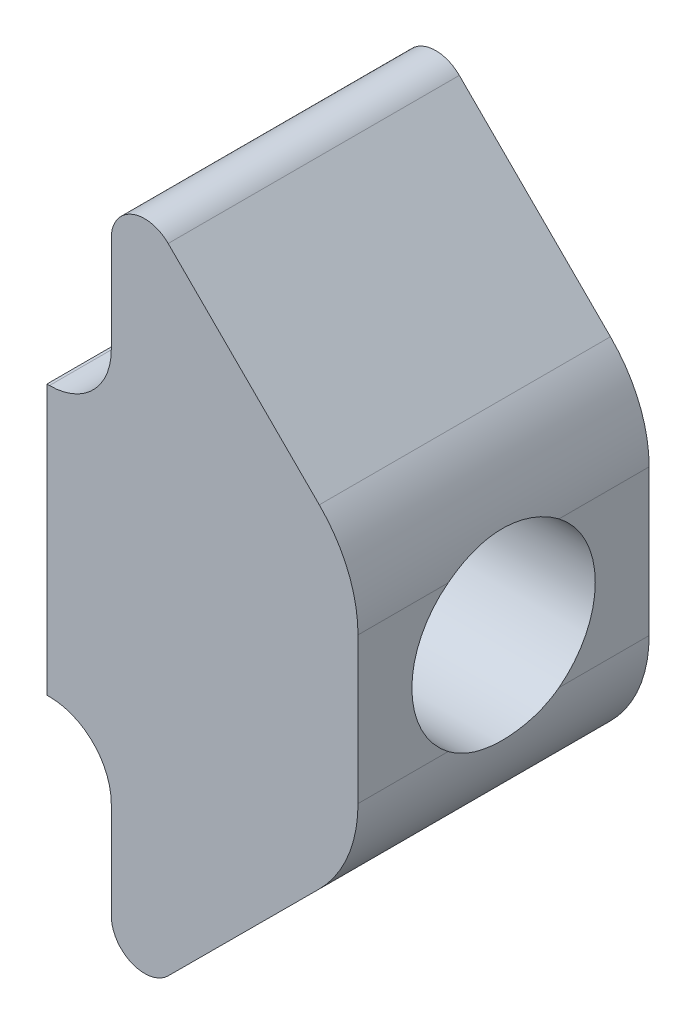
ISO-10303-21;
HEADER;
FILE_DESCRIPTION(('STEP AP214'),'2;1');
FILE_NAME('part.step','',(''),(''),'','','');
FILE_SCHEMA(('AUTOMOTIVE_DESIGN { 1 0 10303 214 1 1 1 1 }'));
ENDSEC;
DATA;
#1=APPLICATION_CONTEXT('core data for automotive mechanical design processes');
#2=APPLICATION_PROTOCOL_DEFINITION('international standard','automotive_design',2000,#1);
#3=PRODUCT_CONTEXT('',#1,'mechanical');
#4=PRODUCT('Part','Part','',(#3));
#5=PRODUCT_RELATED_PRODUCT_CATEGORY('part','',(#4));
#6=PRODUCT_DEFINITION_FORMATION('','',#4);
#7=PRODUCT_DEFINITION_CONTEXT('part definition',#1,'design');
#8=PRODUCT_DEFINITION('design','',#6,#7);
#9=PRODUCT_DEFINITION_SHAPE('','',#8);
#10=(LENGTH_UNIT() NAMED_UNIT(*) SI_UNIT(.MILLI.,.METRE.));
#11=(NAMED_UNIT(*) PLANE_ANGLE_UNIT() SI_UNIT($,.RADIAN.));
#12=(NAMED_UNIT(*) SI_UNIT($,.STERADIAN.) SOLID_ANGLE_UNIT());
#13=UNCERTAINTY_MEASURE_WITH_UNIT(LENGTH_MEASURE(1.E-05),#10,'distance_accuracy_value','');
#14=(GEOMETRIC_REPRESENTATION_CONTEXT(3) GLOBAL_UNCERTAINTY_ASSIGNED_CONTEXT((#13)) GLOBAL_UNIT_ASSIGNED_CONTEXT((#10,
#11,#12)) REPRESENTATION_CONTEXT('',''));
#15=CARTESIAN_POINT('',(0.,0.,0.));
#16=DIRECTION('',(0.,0.,1.));
#17=DIRECTION('',(1.,0.,0.));
#18=AXIS2_PLACEMENT_3D('',#15,#16,#17);
#19=CARTESIAN_POINT('',(-4.80850000000001,1.59318550686057,6.35));
#20=DIRECTION('',(1.,0.,0.));
#21=DIRECTION('',(0.,1.,0.));
#22=AXIS2_PLACEMENT_3D('',#19,#20,#21);
#23=PLANE('',#22);
#24=CARTESIAN_POINT('',(-4.80850000000001,0.,3.175));
#25=DIRECTION('',(1.,0.,0.));
#26=DIRECTION('',(0.,1.,0.));
#27=AXIS2_PLACEMENT_3D('',#24,#25,#26);
#28=CIRCLE('',#27,2.);
#29=CARTESIAN_POINT('',(-4.8085,-1.59318550686057,4.38403264667643));
#30=VERTEX_POINT('',#29);
#31=CARTESIAN_POINT('',(-4.80850000000002,1.59318550686057,4.38403264667644));
#32=VERTEX_POINT('',#31);
#33=EDGE_CURVE('E333',#30,#32,#28,.F.);
#34=ORIENTED_EDGE('',*,*,#33,.T.);
#35=DIRECTION('',(0.,0.,-1.));
#36=VECTOR('',#35,1.);
#37=CARTESIAN_POINT('',(-4.80850000000002,1.59318550686057,6.35));
#38=LINE('',#37,#36);
#39=CARTESIAN_POINT('',(-4.80850000000002,1.59318550686057,6.35));
#40=VERTEX_POINT('',#39);
#41=EDGE_CURVE('E266',#40,#32,#38,.T.);
#42=ORIENTED_EDGE('',*,*,#41,.F.);
#43=DIRECTION('',(0.,-1.,0.));
#44=VECTOR('',#43,1.);
#45=CARTESIAN_POINT('',(-4.80850000000001,1.59318550686057,6.35));
#46=LINE('',#45,#44);
#47=CARTESIAN_POINT('',(-4.8085,-1.59318550686057,6.35));
#48=VERTEX_POINT('',#47);
#49=EDGE_CURVE('E356',#40,#48,#46,.T.);
#50=ORIENTED_EDGE('',*,*,#49,.T.);
#51=DIRECTION('',(0.,0.,-1.));
#52=VECTOR('',#51,1.);
#53=CARTESIAN_POINT('',(-4.8085,-1.59318550686057,6.35));
#54=LINE('',#53,#52);
#55=EDGE_CURVE('E261',#48,#30,#54,.T.);
#56=ORIENTED_EDGE('',*,*,#55,.T.);
#57=EDGE_LOOP('',(#34,#42,#50,#56));
#58=FACE_BOUND('',#57,.T.);
#59=ADVANCED_FACE('F45',(#58),#23,.T.);
#60=CARTESIAN_POINT('',(-11.5392124071298,-2.93845688183043,6.35));
#61=DIRECTION('',(0.,-1.,0.));
#62=DIRECTION('',(1.,0.,0.));
#63=AXIS2_PLACEMENT_3D('',#60,#61,#62);
#64=PLANE('',#63);
#65=DIRECTION('',(-1.,0.,0.));
#66=VECTOR('',#65,1.);
#67=CARTESIAN_POINT('',(-11.5392124071298,-2.93845688183043,0.));
#68=LINE('',#67,#66);
#69=CARTESIAN_POINT('',(-11.5392124071298,-2.93845688183043,0.));
#70=VERTEX_POINT('',#69);
#71=CARTESIAN_POINT('',(-11.5951,-2.93845688183043,0.));
#72=VERTEX_POINT('',#71);
#73=EDGE_CURVE('E197',#70,#72,#68,.T.);
#74=ORIENTED_EDGE('',*,*,#73,.F.);
#75=DIRECTION('',(0.,0.,-1.));
#76=VECTOR('',#75,1.);
#77=CARTESIAN_POINT('',(-11.5392124071298,-2.93845688183043,6.35));
#78=LINE('',#77,#76);
#79=CARTESIAN_POINT('',(-11.5392124071298,-2.93845688183043,6.35));
#80=VERTEX_POINT('',#79);
#81=EDGE_CURVE('E71',#80,#70,#78,.T.);
#82=ORIENTED_EDGE('',*,*,#81,.F.);
#83=DIRECTION('',(-1.,0.,0.));
#84=VECTOR('',#83,1.);
#85=CARTESIAN_POINT('',(-11.5392124071298,-2.93845688183043,6.35));
#86=LINE('',#85,#84);
#87=CARTESIAN_POINT('',(-11.5951,-2.93845688183043,6.35));
#88=VERTEX_POINT('',#87);
#89=EDGE_CURVE('E251',#80,#88,#86,.T.);
#90=ORIENTED_EDGE('',*,*,#89,.T.);
#91=DIRECTION('',(0.,0.,-1.));
#92=VECTOR('',#91,1.);
#93=CARTESIAN_POINT('',(-11.5951,-2.93845688183043,6.35));
#94=LINE('',#93,#92);
#95=EDGE_CURVE('E128',#88,#72,#94,.T.);
#96=ORIENTED_EDGE('',*,*,#95,.T.);
#97=EDGE_LOOP('',(#74,#82,#90,#96));
#98=FACE_BOUND('',#97,.T.);
#99=ADVANCED_FACE('F305',(#98),#64,.T.);
#100=CARTESIAN_POINT('',(-11.5392124071298,-4.28746928896025,6.35));
#101=DIRECTION('',(0.,0.,-1.));
#102=DIRECTION('',(-1.,0.,0.));
#103=AXIS2_PLACEMENT_3D('',#100,#101,#102);
#104=CYLINDRICAL_SURFACE('',#103,1.34901240712982);
#105=CARTESIAN_POINT('',(-11.5392124071298,-4.28746928896025,0.));
#106=DIRECTION('',(0.,0.,1.));
#107=DIRECTION('',(1.,0.,0.));
#108=AXIS2_PLACEMENT_3D('',#105,#106,#107);
#109=CIRCLE('',#108,1.34901240712982);
#110=CARTESIAN_POINT('',(-10.1902,-4.28746928896025,0.));
#111=VERTEX_POINT('',#110);
#112=EDGE_CURVE('E247',#111,#70,#109,.T.);
#113=ORIENTED_EDGE('',*,*,#112,.F.);
#114=DIRECTION('',(0.,0.,-1.));
#115=VECTOR('',#114,1.);
#116=CARTESIAN_POINT('',(-10.1902,-4.28746928896025,6.35));
#117=LINE('',#116,#115);
#118=CARTESIAN_POINT('',(-10.1902,-4.28746928896025,6.35));
#119=VERTEX_POINT('',#118);
#120=EDGE_CURVE('E177',#119,#111,#117,.T.);
#121=ORIENTED_EDGE('',*,*,#120,.F.);
#122=CARTESIAN_POINT('',(-11.5392124071298,-4.28746928896025,6.35));
#123=DIRECTION('',(0.,0.,1.));
#124=DIRECTION('',(1.,0.,0.));
#125=AXIS2_PLACEMENT_3D('',#122,#123,#124);
#126=CIRCLE('',#125,1.34901240712982);
#127=EDGE_CURVE('E190',#119,#80,#126,.T.);
#128=ORIENTED_EDGE('',*,*,#127,.T.);
#129=ORIENTED_EDGE('',*,*,#81,.T.);
#130=EDGE_LOOP('',(#113,#121,#128,#129));
#131=FACE_BOUND('',#130,.T.);
#132=ADVANCED_FACE('F312',(#131),#104,.F.);
#133=CARTESIAN_POINT('',(-10.1902,-6.4020890233125,6.35));
#134=DIRECTION('',(-1.,0.,0.));
#135=DIRECTION('',(0.,0.,1.));
#136=AXIS2_PLACEMENT_3D('',#133,#134,#135);
#137=PLANE('',#136);
#138=DIRECTION('',(0.,1.,0.));
#139=VECTOR('',#138,1.);
#140=CARTESIAN_POINT('',(-10.1902,-6.4020890233125,0.));
#141=LINE('',#140,#139);
#142=CARTESIAN_POINT('',(-10.1902,-6.4020890233125,0.));
#143=VERTEX_POINT('',#142);
#144=EDGE_CURVE('E172',#143,#111,#141,.T.);
#145=ORIENTED_EDGE('',*,*,#144,.F.);
#146=DIRECTION('',(0.,0.,-1.));
#147=VECTOR('',#146,1.);
#148=CARTESIAN_POINT('',(-10.1902,-6.4020890233125,6.35));
#149=LINE('',#148,#147);
#150=CARTESIAN_POINT('',(-10.1902,-6.4020890233125,6.35));
#151=VERTEX_POINT('',#150);
#152=EDGE_CURVE('E165',#151,#143,#149,.T.);
#153=ORIENTED_EDGE('',*,*,#152,.F.);
#154=DIRECTION('',(0.,1.,0.));
#155=VECTOR('',#154,1.);
#156=CARTESIAN_POINT('',(-10.1902,-6.4020890233125,6.35));
#157=LINE('',#156,#155);
#158=EDGE_CURVE('E169',#151,#119,#157,.T.);
#159=ORIENTED_EDGE('',*,*,#158,.T.);
#160=ORIENTED_EDGE('',*,*,#120,.T.);
#161=EDGE_LOOP('',(#145,#153,#159,#160));
#162=FACE_BOUND('',#161,.T.);
#163=ADVANCED_FACE('F167',(#162),#137,.T.);
#164=CARTESIAN_POINT('',(-9.4627890233125,-6.4020890233125,6.35));
#165=DIRECTION('',(0.,0.,-1.));
#166=DIRECTION('',(-1.,0.,0.));
#167=AXIS2_PLACEMENT_3D('',#164,#165,#166);
#168=CYLINDRICAL_SURFACE('',#167,0.727410976687497);
#169=CARTESIAN_POINT('',(-9.4627890233125,-6.4020890233125,0.));
#170=DIRECTION('',(0.,0.,1.));
#171=DIRECTION('',(1.,0.,0.));
#172=AXIS2_PLACEMENT_3D('',#169,#170,#171);
#173=CIRCLE('',#172,0.727410976687497);
#174=CARTESIAN_POINT('',(-8.9490205596463,-6.91703435511728,0.));
#175=VERTEX_POINT('',#174);
#176=EDGE_CURVE('E242',#143,#175,#173,.T.);
#177=ORIENTED_EDGE('',*,*,#176,.T.);
#178=DIRECTION('',(0.,0.,-1.));
#179=VECTOR('',#178,1.);
#180=CARTESIAN_POINT('',(-8.9490205596463,-6.91703435511728,6.35));
#181=LINE('',#180,#179);
#182=CARTESIAN_POINT('',(-8.9490205596463,-6.91703435511728,6.35));
#183=VERTEX_POINT('',#182);
#184=EDGE_CURVE('E178',#183,#175,#181,.T.);
#185=ORIENTED_EDGE('',*,*,#184,.F.);
#186=CARTESIAN_POINT('',(-9.4627890233125,-6.4020890233125,6.35));
#187=DIRECTION('',(0.,0.,1.));
#188=DIRECTION('',(1.,0.,0.));
#189=AXIS2_PLACEMENT_3D('',#186,#187,#188);
#190=CIRCLE('',#189,0.727410976687497);
#191=EDGE_CURVE('E181',#151,#183,#190,.T.);
#192=ORIENTED_EDGE('',*,*,#191,.F.);
#193=ORIENTED_EDGE('',*,*,#152,.T.);
#194=EDGE_LOOP('',(#177,#185,#192,#193));
#195=FACE_BOUND('',#194,.T.);
#196=ADVANCED_FACE('F182',(#195),#168,.T.);
#197=CARTESIAN_POINT('',(-5.65289504574608,-3.62844188377221,6.35));
#198=DIRECTION('',(0.706297375392672,-0.707915261534474,0.));
#199=DIRECTION('',(0.707915261534474,0.706297375392672,0.));
#200=AXIS2_PLACEMENT_3D('',#197,#198,#199);
#201=PLANE('',#200);
#202=DIRECTION('',(-0.707915261534474,-0.706297375392672,0.));
#203=VECTOR('',#202,1.);
#204=CARTESIAN_POINT('',(-5.65289504574608,-3.62844188377221,0.));
#205=LINE('',#204,#203);
#206=CARTESIAN_POINT('',(-5.65289504574608,-3.62844188377221,0.));
#207=VERTEX_POINT('',#206);
#208=EDGE_CURVE('E238',#207,#175,#205,.T.);
#209=ORIENTED_EDGE('',*,*,#208,.F.);
#210=DIRECTION('',(0.,0.,-1.));
#211=VECTOR('',#210,1.);
#212=CARTESIAN_POINT('',(-5.65289504574608,-3.62844188377221,6.35));
#213=LINE('',#212,#211);
#214=CARTESIAN_POINT('',(-5.65289504574608,-3.62844188377221,6.35));
#215=VERTEX_POINT('',#214);
#216=EDGE_CURVE('E258',#215,#207,#213,.T.);
#217=ORIENTED_EDGE('',*,*,#216,.F.);
#218=DIRECTION('',(-0.707915261534474,-0.706297375392672,0.));
#219=VECTOR('',#218,1.);
#220=CARTESIAN_POINT('',(-5.65289504574608,-3.62844188377221,6.35));
#221=LINE('',#220,#219);
#222=EDGE_CURVE('E187',#215,#183,#221,.T.);
#223=ORIENTED_EDGE('',*,*,#222,.T.);
#224=ORIENTED_EDGE('',*,*,#184,.T.);
#225=EDGE_LOOP('',(#209,#217,#223,#224));
#226=FACE_BOUND('',#225,.T.);
#227=ADVANCED_FACE('F326',(#226),#201,.T.);
#228=CARTESIAN_POINT('',(-7.68350000000002,-1.59318550686057,6.35));
#229=DIRECTION('',(0.,0.,-1.));
#230=DIRECTION('',(-1.,0.,0.));
#231=AXIS2_PLACEMENT_3D('',#228,#229,#230);
#232=CYLINDRICAL_SURFACE('',#231,2.87500000000003);
#233=CARTESIAN_POINT('',(-4.8085,-1.59318550686057,1.96596735332357));
#234=VERTEX_POINT('',#233);
#235=CARTESIAN_POINT('',(-4.8085,-1.59318550686057,0.));
#236=VERTEX_POINT('',#235);
#237=EDGE_CURVE('E265',#234,#236,#54,.T.);
#238=ORIENTED_EDGE('',*,*,#237,.F.);
#239=CARTESIAN_POINT('',(-4.8085,-1.59318550686057,4.38403264667643));
#240=CARTESIAN_POINT('',(-4.80850303433566,-1.62712683647098,4.33930689517818));
#241=CARTESIAN_POINT('',(-4.80910043003684,-1.65916359561583,4.29317771547185));
#242=CARTESIAN_POINT('',(-4.81110703606827,-1.71923756115679,4.19841179306501));
#243=CARTESIAN_POINT('',(-4.81251610358679,-1.74727547005862,4.14977549285669));
#244=CARTESIAN_POINT('',(-4.81739294194557,-1.82507253349646,4.00062579631498));
#245=CARTESIAN_POINT('',(-4.82151180149758,-1.8685808819142,3.8967846243462));
#246=CARTESIAN_POINT('',(-4.82899006821415,-1.93758778446916,3.68328858052255));
#247=CARTESIAN_POINT('',(-4.83234933380538,-1.96308298318891,3.57363262960149));
#248=CARTESIAN_POINT('',(-4.83671801569675,-1.99533952059749,3.35159888803065));
#249=CARTESIAN_POINT('',(-4.83772888715847,-2.00211246086194,3.2392228265205));
#250=CARTESIAN_POINT('',(-4.83696396123297,-1.99674812553263,3.01530927028894));
#251=CARTESIAN_POINT('',(-4.83519729135022,-1.98467278972787,2.90377023412419));
#252=CARTESIAN_POINT('',(-4.82966917320102,-1.94208537961817,2.68427813865121));
#253=CARTESIAN_POINT('',(-4.82590693111368,-1.91156596775012,2.57632652455983));
#254=CARTESIAN_POINT('',(-4.81876495693182,-1.8382718531987,2.38121332719397));
#255=CARTESIAN_POINT('',(-4.81540238067888,-1.79771519258447,2.29321552184385));
#256=CARTESIAN_POINT('',(-4.81155453326378,-1.72771074666974,2.1663617157914));
#257=CARTESIAN_POINT('',(-4.81047133438551,-1.70285258548594,2.1249407260873));
#258=CARTESIAN_POINT('',(-4.8089449040642,-1.65019447341362,2.04398719331565));
#259=CARTESIAN_POINT('',(-4.80850182475573,-1.62239382488065,2.00445510133254));
#260=CARTESIAN_POINT('',(-4.8085,-1.59318550686057,1.96596735332357));
#261=B_SPLINE_CURVE_WITH_KNOTS('',3,(#239,#240,#241,#242,#243,#244,#245,#246,#247,#248,#249,
#250,#251,#252,#253,#254,#255,#256,#257,#258,#259,#260),.UNSPECIFIED.,.F.,.F.,(4,2,2,2,2,2,2,2,
2,2,4),(0.,0.168323618887192,0.33661763067825,0.672882531085827,1.00921005307138,
1.34532911704333,1.68034593947898,2.01549612868022,2.30528072834771,2.4501248534122,
2.59500339732372),.UNSPECIFIED.);
#262=EDGE_CURVE('E202',#30,#234,#261,.T.);
#263=ORIENTED_EDGE('',*,*,#262,.F.);
#264=ORIENTED_EDGE('',*,*,#55,.F.);
#265=CARTESIAN_POINT('',(-7.68350000000002,-1.59318550686057,6.35));
#266=DIRECTION('',(0.,0.,1.));
#267=DIRECTION('',(1.,0.,0.));
#268=AXIS2_PLACEMENT_3D('',#265,#266,#267);
#269=CIRCLE('',#268,2.87500000000003);
#270=EDGE_CURVE('E360',#215,#48,#269,.T.);
#271=ORIENTED_EDGE('',*,*,#270,.F.);
#272=ORIENTED_EDGE('',*,*,#216,.T.);
#273=CARTESIAN_POINT('',(-7.68350000000002,-1.59318550686057,0.));
#274=DIRECTION('',(0.,0.,1.));
#275=DIRECTION('',(1.,0.,0.));
#276=AXIS2_PLACEMENT_3D('',#273,#274,#275);
#277=CIRCLE('',#276,2.87500000000003);
#278=EDGE_CURVE('E234',#207,#236,#277,.T.);
#279=ORIENTED_EDGE('',*,*,#278,.T.);
#280=EDGE_LOOP('',(#238,#263,#264,#271,#272,#279));
#281=FACE_BOUND('',#280,.T.);
#282=ADVANCED_FACE('F318',(#281),#232,.T.);
#283=CARTESIAN_POINT('',(-4.80850000000002,1.59318550686057,1.96596735332358));
#284=VERTEX_POINT('',#283);
#285=EDGE_CURVE('E62',#284,#234,#28,.F.);
#286=ORIENTED_EDGE('',*,*,#285,.T.);
#287=ORIENTED_EDGE('',*,*,#237,.T.);
#288=DIRECTION('',(0.,-1.,0.));
#289=VECTOR('',#288,1.);
#290=CARTESIAN_POINT('',(-4.80850000000001,1.59318550686057,0.));
#291=LINE('',#290,#289);
#292=CARTESIAN_POINT('',(-4.80850000000002,1.59318550686057,0.));
#293=VERTEX_POINT('',#292);
#294=EDGE_CURVE('E230',#293,#236,#291,.T.);
#295=ORIENTED_EDGE('',*,*,#294,.F.);
#296=EDGE_CURVE('E270',#284,#293,#38,.T.);
#297=ORIENTED_EDGE('',*,*,#296,.F.);
#298=EDGE_LOOP('',(#286,#287,#295,#297));
#299=FACE_BOUND('',#298,.T.);
#300=ADVANCED_FACE('F308',(#299),#23,.T.);
#301=CARTESIAN_POINT('',(-7.68350000000002,1.59318550686057,6.35));
#302=DIRECTION('',(0.,0.,-1.));
#303=DIRECTION('',(-1.,0.,0.));
#304=AXIS2_PLACEMENT_3D('',#301,#302,#303);
#305=CYLINDRICAL_SURFACE('',#304,2.87500000000001);
#306=ORIENTED_EDGE('',*,*,#41,.T.);
#307=CARTESIAN_POINT('',(-4.80850000000002,1.59318550686057,1.96596735332357));
#308=CARTESIAN_POINT('',(-4.80850303433568,1.62712683647098,2.01069310482182));
#309=CARTESIAN_POINT('',(-4.80910043003686,1.65916359561583,2.05682228452815));
#310=CARTESIAN_POINT('',(-4.81110703606829,1.71923756115679,2.15158820693499));
#311=CARTESIAN_POINT('',(-4.81251610358681,1.74727547005862,2.20022450714331));
#312=CARTESIAN_POINT('',(-4.81739294194559,1.82507253349646,2.34937420368503));
#313=CARTESIAN_POINT('',(-4.8215118014976,1.8685808819142,2.45321537565381));
#314=CARTESIAN_POINT('',(-4.82899006821417,1.93758778446917,2.66671141947745));
#315=CARTESIAN_POINT('',(-4.8323493338054,1.96308298318891,2.77636737039851));
#316=CARTESIAN_POINT('',(-4.83671801569677,1.99533952059749,2.99840111196935));
#317=CARTESIAN_POINT('',(-4.83772888715848,2.00211246086194,3.1107771734795));
#318=CARTESIAN_POINT('',(-4.83696396123299,1.99674812553263,3.33469072971107));
#319=CARTESIAN_POINT('',(-4.83519729135024,1.98467278972787,3.44622976587581));
#320=CARTESIAN_POINT('',(-4.82966917320103,1.94208537961817,3.66572186134879));
#321=CARTESIAN_POINT('',(-4.8259069311137,1.91156596775012,3.77367347544017));
#322=CARTESIAN_POINT('',(-4.81876495693184,1.8382718531987,3.96878667280603));
#323=CARTESIAN_POINT('',(-4.81540238067889,1.79771519258447,4.05678447815615));
#324=CARTESIAN_POINT('',(-4.8115545332638,1.72771074666974,4.1836382842086));
#325=CARTESIAN_POINT('',(-4.81047133438553,1.70285258548595,4.2250592739127));
#326=CARTESIAN_POINT('',(-4.80894490406421,1.65019447341362,4.30601280668435));
#327=CARTESIAN_POINT('',(-4.80850182475574,1.62239382488065,4.34554489866747));
#328=CARTESIAN_POINT('',(-4.80850000000002,1.59318550686057,4.38403264667643));
#329=B_SPLINE_CURVE_WITH_KNOTS('',3,(#307,#308,#309,#310,#311,#312,#313,#314,#315,#316,#317,
#318,#319,#320,#321,#322,#323,#324,#325,#326,#327,#328),.UNSPECIFIED.,.F.,.F.,(4,2,2,2,2,2,2,2,
2,2,4),(0.,0.168323618887194,0.336617630678251,0.672882531085828,1.00921005307138,
1.34532911704333,1.68034593947898,2.01549612868022,2.30528072834771,2.4501248534122,
2.59500339732373),.UNSPECIFIED.);
#330=EDGE_CURVE('E342',#284,#32,#329,.T.);
#331=ORIENTED_EDGE('',*,*,#330,.F.);
#332=ORIENTED_EDGE('',*,*,#296,.T.);
#333=CARTESIAN_POINT('',(-7.68350000000002,1.59318550686057,0.));
#334=DIRECTION('',(0.,0.,1.));
#335=DIRECTION('',(1.,0.,0.));
#336=AXIS2_PLACEMENT_3D('',#333,#334,#335);
#337=CIRCLE('',#336,2.87500000000001);
#338=CARTESIAN_POINT('',(-5.65289504574608,3.62844188377218,0.));
#339=VERTEX_POINT('',#338);
#340=EDGE_CURVE('E226',#293,#339,#337,.T.);
#341=ORIENTED_EDGE('',*,*,#340,.T.);
#342=DIRECTION('',(0.,0.,-1.));
#343=VECTOR('',#342,1.);
#344=CARTESIAN_POINT('',(-5.65289504574608,3.62844188377218,6.35));
#345=LINE('',#344,#343);
#346=CARTESIAN_POINT('',(-5.65289504574608,3.62844188377218,6.35));
#347=VERTEX_POINT('',#346);
#348=EDGE_CURVE('E271',#347,#339,#345,.T.);
#349=ORIENTED_EDGE('',*,*,#348,.F.);
#350=CARTESIAN_POINT('',(-7.68350000000002,1.59318550686057,6.35));
#351=DIRECTION('',(0.,0.,1.));
#352=DIRECTION('',(1.,0.,0.));
#353=AXIS2_PLACEMENT_3D('',#350,#351,#352);
#354=CIRCLE('',#353,2.87500000000001);
#355=EDGE_CURVE('E352',#40,#347,#354,.T.);
#356=ORIENTED_EDGE('',*,*,#355,.F.);
#357=EDGE_LOOP('',(#306,#331,#332,#341,#349,#356));
#358=FACE_BOUND('',#357,.T.);
#359=ADVANCED_FACE('F317',(#358),#305,.T.);
#360=CARTESIAN_POINT('',(-8.9490205596463,6.91703435511728,6.35));
#361=DIRECTION('',(0.706297375392675,0.707915261534471,0.));
#362=DIRECTION('',(-0.707915261534471,0.706297375392675,0.));
#363=AXIS2_PLACEMENT_3D('',#360,#361,#362);
#364=PLANE('',#363);
#365=DIRECTION('',(0.707915261534471,-0.706297375392675,0.));
#366=VECTOR('',#365,1.);
#367=CARTESIAN_POINT('',(-8.9490205596463,6.91703435511728,0.));
#368=LINE('',#367,#366);
#369=CARTESIAN_POINT('',(-8.9490205596463,6.91703435511727,0.));
#370=VERTEX_POINT('',#369);
#371=EDGE_CURVE('E222',#370,#339,#368,.T.);
#372=ORIENTED_EDGE('',*,*,#371,.F.);
#373=DIRECTION('',(0.,0.,-1.));
#374=VECTOR('',#373,1.);
#375=CARTESIAN_POINT('',(-8.9490205596463,6.91703435511727,6.35));
#376=LINE('',#375,#374);
#377=CARTESIAN_POINT('',(-8.9490205596463,6.91703435511727,6.35));
#378=VERTEX_POINT('',#377);
#379=EDGE_CURVE('E274',#378,#370,#376,.T.);
#380=ORIENTED_EDGE('',*,*,#379,.F.);
#381=DIRECTION('',(0.707915261534471,-0.706297375392675,0.));
#382=VECTOR('',#381,1.);
#383=CARTESIAN_POINT('',(-8.9490205596463,6.91703435511728,6.35));
#384=LINE('',#383,#382);
#385=EDGE_CURVE('E350',#378,#347,#384,.T.);
#386=ORIENTED_EDGE('',*,*,#385,.T.);
#387=ORIENTED_EDGE('',*,*,#348,.T.);
#388=EDGE_LOOP('',(#372,#380,#386,#387));
#389=FACE_BOUND('',#388,.T.);
#390=ADVANCED_FACE('F324',(#389),#364,.T.);
#391=CARTESIAN_POINT('',(-9.4627890233125,6.4020890233125,6.35));
#392=DIRECTION('',(0.,0.,-1.));
#393=DIRECTION('',(-1.,0.,0.));
#394=AXIS2_PLACEMENT_3D('',#391,#392,#393);
#395=CYLINDRICAL_SURFACE('',#394,0.727410976687497);
#396=CARTESIAN_POINT('',(-9.4627890233125,6.4020890233125,0.));
#397=DIRECTION('',(0.,0.,1.));
#398=DIRECTION('',(1.,0.,0.));
#399=AXIS2_PLACEMENT_3D('',#396,#397,#398);
#400=CIRCLE('',#399,0.727410976687497);
#401=CARTESIAN_POINT('',(-10.1902,6.4020890233125,0.));
#402=VERTEX_POINT('',#401);
#403=EDGE_CURVE('E218',#370,#402,#400,.T.);
#404=ORIENTED_EDGE('',*,*,#403,.T.);
#405=DIRECTION('',(0.,0.,-1.));
#406=VECTOR('',#405,1.);
#407=CARTESIAN_POINT('',(-10.1902,6.4020890233125,6.35));
#408=LINE('',#407,#406);
#409=CARTESIAN_POINT('',(-10.1902,6.4020890233125,6.35));
#410=VERTEX_POINT('',#409);
#411=EDGE_CURVE('E277',#410,#402,#408,.T.);
#412=ORIENTED_EDGE('',*,*,#411,.F.);
#413=CARTESIAN_POINT('',(-9.4627890233125,6.4020890233125,6.35));
#414=DIRECTION('',(0.,0.,1.));
#415=DIRECTION('',(1.,0.,0.));
#416=AXIS2_PLACEMENT_3D('',#413,#414,#415);
#417=CIRCLE('',#416,0.727410976687497);
#418=EDGE_CURVE('E408',#378,#410,#417,.T.);
#419=ORIENTED_EDGE('',*,*,#418,.F.);
#420=ORIENTED_EDGE('',*,*,#379,.T.);
#421=EDGE_LOOP('',(#404,#412,#419,#420));
#422=FACE_BOUND('',#421,.T.);
#423=ADVANCED_FACE('F415',(#422),#395,.T.);
#424=CARTESIAN_POINT('',(-10.1902,4.28746928896025,6.35));
#425=DIRECTION('',(-1.,0.,0.));
#426=DIRECTION('',(0.,0.,1.));
#427=AXIS2_PLACEMENT_3D('',#424,#425,#426);
#428=PLANE('',#427);
#429=DIRECTION('',(0.,1.,0.));
#430=VECTOR('',#429,1.);
#431=CARTESIAN_POINT('',(-10.1902,4.28746928896025,0.));
#432=LINE('',#431,#430);
#433=CARTESIAN_POINT('',(-10.1902,4.28746928896025,0.));
#434=VERTEX_POINT('',#433);
#435=EDGE_CURVE('E214',#434,#402,#432,.T.);
#436=ORIENTED_EDGE('',*,*,#435,.F.);
#437=DIRECTION('',(0.,0.,-1.));
#438=VECTOR('',#437,1.);
#439=CARTESIAN_POINT('',(-10.1902,4.28746928896025,6.35));
#440=LINE('',#439,#438);
#441=CARTESIAN_POINT('',(-10.1902,4.28746928896025,6.35));
#442=VERTEX_POINT('',#441);
#443=EDGE_CURVE('E280',#442,#434,#440,.T.);
#444=ORIENTED_EDGE('',*,*,#443,.F.);
#445=DIRECTION('',(0.,1.,0.));
#446=VECTOR('',#445,1.);
#447=CARTESIAN_POINT('',(-10.1902,4.28746928896025,6.35));
#448=LINE('',#447,#446);
#449=EDGE_CURVE('E404',#442,#410,#448,.T.);
#450=ORIENTED_EDGE('',*,*,#449,.T.);
#451=ORIENTED_EDGE('',*,*,#411,.T.);
#452=EDGE_LOOP('',(#436,#444,#450,#451));
#453=FACE_BOUND('',#452,.T.);
#454=ADVANCED_FACE('F418',(#453),#428,.T.);
#455=CARTESIAN_POINT('',(-11.5392124071298,4.28746928896025,6.35));
#456=DIRECTION('',(0.,0.,-1.));
#457=DIRECTION('',(-1.,0.,0.));
#458=AXIS2_PLACEMENT_3D('',#455,#456,#457);
#459=CYLINDRICAL_SURFACE('',#458,1.34901240712982);
#460=CARTESIAN_POINT('',(-11.5392124071298,4.28746928896025,0.));
#461=DIRECTION('',(0.,0.,1.));
#462=DIRECTION('',(1.,0.,0.));
#463=AXIS2_PLACEMENT_3D('',#460,#461,#462);
#464=CIRCLE('',#463,1.34901240712982);
#465=CARTESIAN_POINT('',(-11.5392124071298,2.93845688183043,0.));
#466=VERTEX_POINT('',#465);
#467=EDGE_CURVE('E210',#466,#434,#464,.T.);
#468=ORIENTED_EDGE('',*,*,#467,.F.);
#469=DIRECTION('',(0.,0.,-1.));
#470=VECTOR('',#469,1.);
#471=CARTESIAN_POINT('',(-11.5392124071298,2.93845688183043,6.35));
#472=LINE('',#471,#470);
#473=CARTESIAN_POINT('',(-11.5392124071298,2.93845688183043,6.35));
#474=VERTEX_POINT('',#473);
#475=EDGE_CURVE('E283',#474,#466,#472,.T.);
#476=ORIENTED_EDGE('',*,*,#475,.F.);
#477=CARTESIAN_POINT('',(-11.5392124071298,4.28746928896025,6.35));
#478=DIRECTION('',(0.,0.,1.));
#479=DIRECTION('',(1.,0.,0.));
#480=AXIS2_PLACEMENT_3D('',#477,#478,#479);
#481=CIRCLE('',#480,1.34901240712982);
#482=EDGE_CURVE('E400',#474,#442,#481,.T.);
#483=ORIENTED_EDGE('',*,*,#482,.T.);
#484=ORIENTED_EDGE('',*,*,#443,.T.);
#485=EDGE_LOOP('',(#468,#476,#483,#484));
#486=FACE_BOUND('',#485,.T.);
#487=ADVANCED_FACE('F421',(#486),#459,.F.);
#488=CARTESIAN_POINT('',(-11.5951,2.93845688183043,6.35));
#489=DIRECTION('',(0.,1.,0.));
#490=DIRECTION('',(0.,0.,1.));
#491=AXIS2_PLACEMENT_3D('',#488,#489,#490);
#492=PLANE('',#491);
#493=DIRECTION('',(1.,0.,0.));
#494=VECTOR('',#493,1.);
#495=CARTESIAN_POINT('',(-11.5951,2.93845688183043,0.));
#496=LINE('',#495,#494);
#497=CARTESIAN_POINT('',(-11.5951,2.93845688183043,0.));
#498=VERTEX_POINT('',#497);
#499=EDGE_CURVE('E206',#498,#466,#496,.T.);
#500=ORIENTED_EDGE('',*,*,#499,.F.);
#501=DIRECTION('',(0.,0.,-1.));
#502=VECTOR('',#501,1.);
#503=CARTESIAN_POINT('',(-11.5951,2.93845688183043,6.35));
#504=LINE('',#503,#502);
#505=CARTESIAN_POINT('',(-11.5951,2.93845688183043,6.35));
#506=VERTEX_POINT('',#505);
#507=EDGE_CURVE('E286',#506,#498,#504,.T.);
#508=ORIENTED_EDGE('',*,*,#507,.F.);
#509=DIRECTION('',(1.,0.,0.));
#510=VECTOR('',#509,1.);
#511=CARTESIAN_POINT('',(-11.5951,2.93845688183043,6.35));
#512=LINE('',#511,#510);
#513=EDGE_CURVE('E396',#506,#474,#512,.T.);
#514=ORIENTED_EDGE('',*,*,#513,.T.);
#515=ORIENTED_EDGE('',*,*,#475,.T.);
#516=EDGE_LOOP('',(#500,#508,#514,#515));
#517=FACE_BOUND('',#516,.T.);
#518=ADVANCED_FACE('F425',(#517),#492,.T.);
#519=CARTESIAN_POINT('',(-11.5951,-2.93845688183043,6.35));
#520=DIRECTION('',(-1.,0.,0.));
#521=DIRECTION('',(0.,0.,1.));
#522=AXIS2_PLACEMENT_3D('',#519,#520,#521);
#523=PLANE('',#522);
#524=CARTESIAN_POINT('',(-11.5951,0.,3.175));
#525=DIRECTION('',(-1.,0.,0.));
#526=DIRECTION('',(0.,0.,1.));
#527=AXIS2_PLACEMENT_3D('',#524,#525,#526);
#528=CIRCLE('',#527,2.4);
#529=CARTESIAN_POINT('',(-11.5951,0.,5.575));
#530=VERTEX_POINT('',#529);
#531=EDGE_CURVE('E13',#530,#530,#528,.F.);
#532=ORIENTED_EDGE('',*,*,#531,.T.);
#533=EDGE_LOOP('',(#532));
#534=FACE_BOUND('',#533,.T.);
#535=DIRECTION('',(0.,1.,0.));
#536=VECTOR('',#535,1.);
#537=CARTESIAN_POINT('',(-11.5951,-2.93845688183043,0.));
#538=LINE('',#537,#536);
#539=EDGE_CURVE('E201',#72,#498,#538,.T.);
#540=ORIENTED_EDGE('',*,*,#539,.F.);
#541=ORIENTED_EDGE('',*,*,#95,.F.);
#542=DIRECTION('',(0.,1.,0.));
#543=VECTOR('',#542,1.);
#544=CARTESIAN_POINT('',(-11.5951,-2.93845688183043,6.35));
#545=LINE('',#544,#543);
#546=EDGE_CURVE('E393',#88,#506,#545,.T.);
#547=ORIENTED_EDGE('',*,*,#546,.T.);
#548=ORIENTED_EDGE('',*,*,#507,.T.);
#549=EDGE_LOOP('',(#540,#541,#547,#548));
#550=FACE_BOUND('',#549,.T.);
#551=ADVANCED_FACE('F426',(#534,#550),#523,.T.);
#552=CARTESIAN_POINT('',(-11.5392124071298,4.28746928896025,6.35));
#553=DIRECTION('',(0.,0.,1.));
#554=DIRECTION('',(1.,0.,0.));
#555=AXIS2_PLACEMENT_3D('',#552,#553,#554);
#556=PLANE('',#555);
#557=ORIENTED_EDGE('',*,*,#89,.F.);
#558=ORIENTED_EDGE('',*,*,#127,.F.);
#559=ORIENTED_EDGE('',*,*,#158,.F.);
#560=ORIENTED_EDGE('',*,*,#191,.T.);
#561=ORIENTED_EDGE('',*,*,#222,.F.);
#562=ORIENTED_EDGE('',*,*,#270,.T.);
#563=ORIENTED_EDGE('',*,*,#49,.F.);
#564=ORIENTED_EDGE('',*,*,#355,.T.);
#565=ORIENTED_EDGE('',*,*,#385,.F.);
#566=ORIENTED_EDGE('',*,*,#418,.T.);
#567=ORIENTED_EDGE('',*,*,#449,.F.);
#568=ORIENTED_EDGE('',*,*,#482,.F.);
#569=ORIENTED_EDGE('',*,*,#513,.F.);
#570=ORIENTED_EDGE('',*,*,#546,.F.);
#571=EDGE_LOOP('',(#557,#558,#559,#560,#561,#562,#563,#564,#565,#566,#567,#568,#569,#570));
#572=FACE_BOUND('',#571,.T.);
#573=ADVANCED_FACE('F189',(#572),#556,.T.);
#574=CARTESIAN_POINT('',(-11.5392124071298,4.28746928896025,0.));
#575=DIRECTION('',(0.,0.,1.));
#576=DIRECTION('',(1.,0.,0.));
#577=AXIS2_PLACEMENT_3D('',#574,#575,#576);
#578=PLANE('',#577);
#579=ORIENTED_EDGE('',*,*,#73,.T.);
#580=ORIENTED_EDGE('',*,*,#539,.T.);
#581=ORIENTED_EDGE('',*,*,#499,.T.);
#582=ORIENTED_EDGE('',*,*,#467,.T.);
#583=ORIENTED_EDGE('',*,*,#435,.T.);
#584=ORIENTED_EDGE('',*,*,#403,.F.);
#585=ORIENTED_EDGE('',*,*,#371,.T.);
#586=ORIENTED_EDGE('',*,*,#340,.F.);
#587=ORIENTED_EDGE('',*,*,#294,.T.);
#588=ORIENTED_EDGE('',*,*,#278,.F.);
#589=ORIENTED_EDGE('',*,*,#208,.T.);
#590=ORIENTED_EDGE('',*,*,#176,.F.);
#591=ORIENTED_EDGE('',*,*,#144,.T.);
#592=ORIENTED_EDGE('',*,*,#112,.T.);
#593=EDGE_LOOP('',(#579,#580,#581,#582,#583,#584,#585,#586,#587,#588,#589,#590,#591,#592));
#594=FACE_BOUND('',#593,.T.);
#595=ADVANCED_FACE('F301',(#594),#578,.F.);
#596=CARTESIAN_POINT('',(-4.8075,0.,3.175));
#597=DIRECTION('',(-1.,0.,0.));
#598=DIRECTION('',(0.,0.,1.));
#599=AXIS2_PLACEMENT_3D('',#596,#597,#598);
#600=CYLINDRICAL_SURFACE('',#599,2.);
#601=CARTESIAN_POINT('',(-11.1951,0.,3.175));
#602=DIRECTION('',(-1.,0.,0.));
#603=DIRECTION('',(0.,0.,1.));
#604=AXIS2_PLACEMENT_3D('',#601,#602,#603);
#605=CIRCLE('',#604,2.);
#606=CARTESIAN_POINT('',(-11.1951,0.,5.175));
#607=VERTEX_POINT('',#606);
#608=EDGE_CURVE('E55',#607,#607,#605,.T.);
#609=ORIENTED_EDGE('',*,*,#608,.T.);
#610=EDGE_LOOP('',(#609));
#611=FACE_BOUND('',#610,.T.);
#612=ORIENTED_EDGE('',*,*,#262,.T.);
#613=ORIENTED_EDGE('',*,*,#285,.F.);
#614=ORIENTED_EDGE('',*,*,#330,.T.);
#615=ORIENTED_EDGE('',*,*,#33,.F.);
#616=EDGE_LOOP('',(#612,#613,#614,#615));
#617=FACE_BOUND('',#616,.T.);
#618=ADVANCED_FACE('F294',(#611,#617),#600,.F.);
#619=CARTESIAN_POINT('',(-11.1951,0.,3.175));
#620=DIRECTION('',(-1.,0.,0.));
#621=DIRECTION('',(0.,0.,1.));
#622=AXIS2_PLACEMENT_3D('',#619,#620,#621);
#623=CONICAL_SURFACE('',#622,2.,0.785398163397449);
#624=CARTESIAN_POINT('',(-11.5951,0.,5.575));
#625=CARTESIAN_POINT('',(-11.5909333333333,0.,5.57083333333333));
#626=CARTESIAN_POINT('',(-11.5867666666667,0.,5.56666666666667));
#627=CARTESIAN_POINT('',(-11.5784333333333,0.,5.55833333333333));
#628=CARTESIAN_POINT('',(-11.5742666666667,0.,5.55416666666667));
#629=CARTESIAN_POINT('',(-11.5659333333333,0.,5.54583333333333));
#630=CARTESIAN_POINT('',(-11.5617666666667,0.,5.54166666666667));
#631=CARTESIAN_POINT('',(-11.5534333333333,0.,5.53333333333333));
#632=CARTESIAN_POINT('',(-11.5492666666667,0.,5.52916666666667));
#633=CARTESIAN_POINT('',(-11.5409333333333,0.,5.52083333333333));
#634=CARTESIAN_POINT('',(-11.5367666666667,0.,5.51666666666667));
#635=CARTESIAN_POINT('',(-11.5284333333333,0.,5.50833333333333));
#636=CARTESIAN_POINT('',(-11.5242666666667,0.,5.50416666666667));
#637=CARTESIAN_POINT('',(-11.5159333333333,0.,5.49583333333333));
#638=CARTESIAN_POINT('',(-11.5117666666667,0.,5.49166666666667));
#639=CARTESIAN_POINT('',(-11.5034333333333,0.,5.48333333333333));
#640=CARTESIAN_POINT('',(-11.4992666666667,0.,5.47916666666667));
#641=CARTESIAN_POINT('',(-11.4909333333333,0.,5.47083333333333));
#642=CARTESIAN_POINT('',(-11.4867666666667,0.,5.46666666666667));
#643=CARTESIAN_POINT('',(-11.4784333333333,0.,5.45833333333333));
#644=CARTESIAN_POINT('',(-11.4742666666667,0.,5.45416666666667));
#645=CARTESIAN_POINT('',(-11.4659333333333,0.,5.44583333333333));
#646=CARTESIAN_POINT('',(-11.4617666666667,0.,5.44166666666667));
#647=CARTESIAN_POINT('',(-11.4534333333333,0.,5.43333333333333));
#648=CARTESIAN_POINT('',(-11.4492666666667,0.,5.42916666666667));
#649=CARTESIAN_POINT('',(-11.4409333333333,0.,5.42083333333333));
#650=CARTESIAN_POINT('',(-11.4367666666667,0.,5.41666666666667));
#651=CARTESIAN_POINT('',(-11.4284333333333,0.,5.40833333333333));
#652=CARTESIAN_POINT('',(-11.4242666666667,0.,5.40416666666667));
#653=CARTESIAN_POINT('',(-11.4159333333333,0.,5.39583333333333));
#654=CARTESIAN_POINT('',(-11.4117666666667,0.,5.39166666666667));
#655=CARTESIAN_POINT('',(-11.4034333333333,0.,5.38333333333333));
#656=CARTESIAN_POINT('',(-11.3992666666667,0.,5.37916666666667));
#657=CARTESIAN_POINT('',(-11.3909333333333,0.,5.37083333333333));
#658=CARTESIAN_POINT('',(-11.3867666666667,0.,5.36666666666667));
#659=CARTESIAN_POINT('',(-11.3784333333333,0.,5.35833333333333));
#660=CARTESIAN_POINT('',(-11.3742666666667,0.,5.35416666666667));
#661=CARTESIAN_POINT('',(-11.3659333333333,0.,5.34583333333333));
#662=CARTESIAN_POINT('',(-11.3617666666667,0.,5.34166666666667));
#663=CARTESIAN_POINT('',(-11.3534333333333,0.,5.33333333333333));
#664=CARTESIAN_POINT('',(-11.3492666666667,0.,5.32916666666667));
#665=CARTESIAN_POINT('',(-11.3409333333333,0.,5.32083333333333));
#666=CARTESIAN_POINT('',(-11.3367666666667,0.,5.31666666666667));
#667=CARTESIAN_POINT('',(-11.3284333333333,0.,5.30833333333333));
#668=CARTESIAN_POINT('',(-11.3242666666667,0.,5.30416666666667));
#669=CARTESIAN_POINT('',(-11.3159333333333,0.,5.29583333333333));
#670=CARTESIAN_POINT('',(-11.3117666666667,0.,5.29166666666667));
#671=CARTESIAN_POINT('',(-11.3034333333333,0.,5.28333333333333));
#672=CARTESIAN_POINT('',(-11.2992666666667,0.,5.27916666666667));
#673=CARTESIAN_POINT('',(-11.2909333333333,0.,5.27083333333333));
#674=CARTESIAN_POINT('',(-11.2867666666667,0.,5.26666666666667));
#675=CARTESIAN_POINT('',(-11.2784333333333,0.,5.25833333333333));
#676=CARTESIAN_POINT('',(-11.2742666666667,0.,5.25416666666667));
#677=CARTESIAN_POINT('',(-11.2659333333333,0.,5.24583333333333));
#678=CARTESIAN_POINT('',(-11.2617666666667,0.,5.24166666666667));
#679=CARTESIAN_POINT('',(-11.2534333333333,0.,5.23333333333333));
#680=CARTESIAN_POINT('',(-11.2492666666667,0.,5.22916666666667));
#681=CARTESIAN_POINT('',(-11.2409333333333,0.,5.22083333333333));
#682=CARTESIAN_POINT('',(-11.2367666666667,0.,5.21666666666667));
#683=CARTESIAN_POINT('',(-11.2284333333333,0.,5.20833333333333));
#684=CARTESIAN_POINT('',(-11.2242666666667,0.,5.20416666666667));
#685=CARTESIAN_POINT('',(-11.2159333333333,0.,5.19583333333333));
#686=CARTESIAN_POINT('',(-11.2117666666667,0.,5.19166666666667));
#687=CARTESIAN_POINT('',(-11.2034333333333,0.,5.18333333333333));
#688=CARTESIAN_POINT('',(-11.1992666666667,0.,5.17916666666667));
#689=CARTESIAN_POINT('',(-11.1951,0.,5.175));
#690=B_SPLINE_CURVE_WITH_KNOTS('',3,(#624,#625,#626,#627,#628,#629,#630,#631,#632,#633,#634,
#635,#636,#637,#638,#639,#640,#641,#642,#643,#644,#645,#646,#647,#648,#649,#650,#651,#652,#653,
#654,#655,#656,#657,#658,#659,#660,#661,#662,#663,#664,#665,#666,#667,#668,#669,#670,#671,#672,
#673,#674,#675,#676,#677,#678,#679,#680,#681,#682,#683,#684,#685,#686,#687,#688,#689),
.UNSPECIFIED.,.F.,.F.,(4,2,2,2,2,2,2,2,2,2,2,2,2,2,2,2,2,2,2,2,2,2,2,2,2,2,2,2,2,2,2,2,4),(0.,
0.0176776695296636,0.0353553390593272,0.0530330085889914,0.0707106781186556,0.0883883476483185,
0.106066017177982,0.123743686707646,0.14142135623731,0.159099025766974,0.176776695296637,
0.194454364826301,0.212132034355964,0.229809703885628,0.247487373415291,0.265165042944956,
0.282842712474619,0.300520382004283,0.318198051533947,0.33587572106361,0.353553390593274,
0.371231060122938,0.388908729652601,0.406586399182264,0.424264068711929,0.441941738241593,
0.459619407771256,0.47729707730092,0.494974746830583,0.512652416360247,0.530330085889911,
0.548007755419575,0.565685424949237),.UNSPECIFIED.);
#691=EDGE_CURVE('BSEAM48',#530,#607,#690,.T.);
#692=ORIENTED_EDGE('',*,*,#531,.F.);
#693=ORIENTED_EDGE('',*,*,#608,.F.);
#694=ORIENTED_EDGE('',*,*,#691,.T.);
#695=ORIENTED_EDGE('',*,*,#691,.F.);
#696=EDGE_LOOP('',(#692,#694,#693,#695));
#697=FACE_BOUND('',#696,.T.);
#698=ADVANCED_FACE('F48',(#697),#623,.F.);
#699=CLOSED_SHELL('',(#59,#99,#132,#163,#196,#227,#282,#300,#359,#390,#423,#454,#487,#518,#551,
#573,#595,#618,#698));
#700=MANIFOLD_SOLID_BREP('B2',#699);
#701=ADVANCED_BREP_SHAPE_REPRESENTATION('',(#18,#700),#14);
#702=SHAPE_DEFINITION_REPRESENTATION(#9,#701);
ENDSEC;
END-ISO-10303-21;
